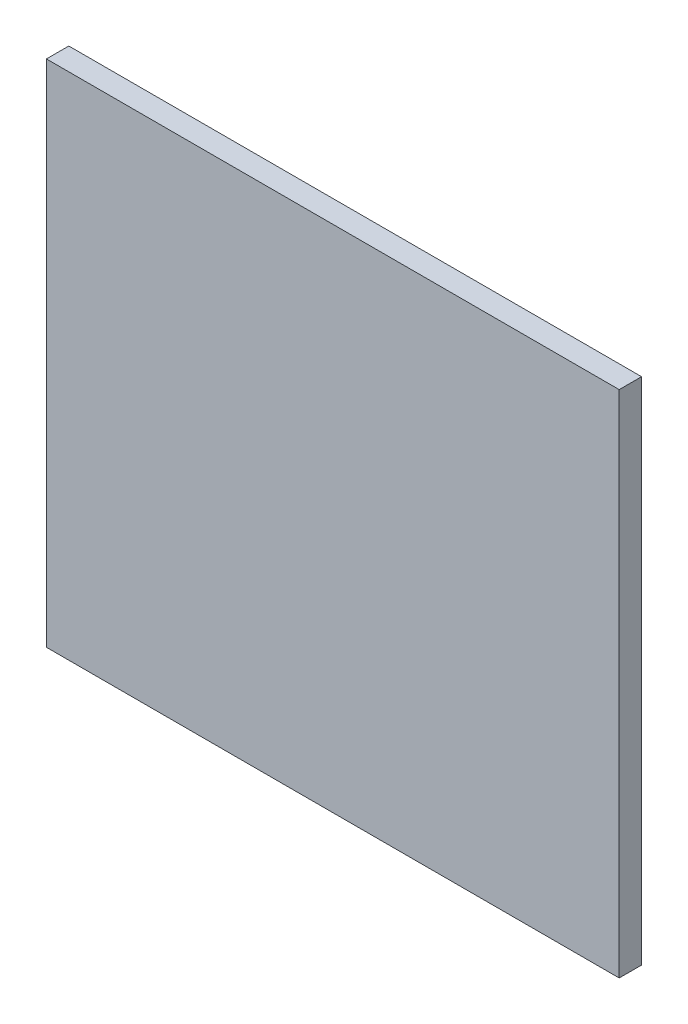
ISO-10303-21;
HEADER;
FILE_DESCRIPTION(('STEP AP214'),'2;1');
FILE_NAME('part.step','',(''),(''),'','','');
FILE_SCHEMA(('AUTOMOTIVE_DESIGN { 1 0 10303 214 1 1 1 1 }'));
ENDSEC;
DATA;
#1=APPLICATION_CONTEXT('core data for automotive mechanical design processes');
#2=APPLICATION_PROTOCOL_DEFINITION('international standard','automotive_design',2000,#1);
#3=PRODUCT_CONTEXT('',#1,'mechanical');
#4=PRODUCT('Part','Part','',(#3));
#5=PRODUCT_RELATED_PRODUCT_CATEGORY('part','',(#4));
#6=PRODUCT_DEFINITION_FORMATION('','',#4);
#7=PRODUCT_DEFINITION_CONTEXT('part definition',#1,'design');
#8=PRODUCT_DEFINITION('design','',#6,#7);
#9=PRODUCT_DEFINITION_SHAPE('','',#8);
#10=(LENGTH_UNIT() NAMED_UNIT(*) SI_UNIT(.MILLI.,.METRE.));
#11=(NAMED_UNIT(*) PLANE_ANGLE_UNIT() SI_UNIT($,.RADIAN.));
#12=(NAMED_UNIT(*) SI_UNIT($,.STERADIAN.) SOLID_ANGLE_UNIT());
#13=UNCERTAINTY_MEASURE_WITH_UNIT(LENGTH_MEASURE(1.E-05),#10,'distance_accuracy_value','');
#14=(GEOMETRIC_REPRESENTATION_CONTEXT(3) GLOBAL_UNCERTAINTY_ASSIGNED_CONTEXT((#13)) GLOBAL_UNIT_ASSIGNED_CONTEXT((#10,
#11,#12)) REPRESENTATION_CONTEXT('',''));
#15=CARTESIAN_POINT('',(0.,0.,0.));
#16=DIRECTION('',(0.,0.,1.));
#17=DIRECTION('',(1.,0.,0.));
#18=AXIS2_PLACEMENT_3D('',#15,#16,#17);
#19=CARTESIAN_POINT('',(91.50000122,25.5000006,-1.606522083282));
#20=DIRECTION('',(0.,8.74227765734797E-08,-0.999999999999996));
#21=DIRECTION('',(0.,0.999999999999996,8.74227765734797E-08));
#22=AXIS2_PLACEMENT_3D('',#19,#20,#21);
#23=PLANE('',#22);
#24=DIRECTION('',(-4.371138800918E-08,-0.999999999999999,0.));
#25=VECTOR('',#24,1.);
#26=CARTESIAN_POINT('',(88.940001059251,21.822500711901,-1.606522282388));
#27=LINE('',#26,#25);
#28=CARTESIAN_POINT('',(88.940001120447,23.2225006603219,-1.60652228238784));
#29=VERTEX_POINT('',#28);
#30=CARTESIAN_POINT('',(88.9400012199998,27.777500711901,-1.60652198372956));
#31=VERTEX_POINT('',#30);
#32=EDGE_CURVE('E61',#29,#31,#27,.F.);
#33=ORIENTED_EDGE('',*,*,#32,.F.);
#34=DIRECTION('',(0.999999999999999,-4.37113880091796E-08,0.));
#35=VECTOR('',#34,1.);
#36=CARTESIAN_POINT('',(94.060001120447,23.222500488099,-1.606522282388));
#37=LINE('',#36,#35);
#38=CARTESIAN_POINT('',(94.0600012200002,23.222500488099,-1.60652218283494));
#39=VERTEX_POINT('',#38);
#40=EDGE_CURVE('E56',#39,#29,#37,.F.);
#41=ORIENTED_EDGE('',*,*,#40,.F.);
#42=DIRECTION('',(4.371138800918E-08,0.999999999999999,0.));
#43=VECTOR('',#42,1.);
#44=CARTESIAN_POINT('',(94.060001380749,29.177500488099,-1.606521884177));
#45=LINE('',#44,#43);
#46=CARTESIAN_POINT('',(94.060001319553,27.7775006043709,-1.60652188417681));
#47=VERTEX_POINT('',#46);
#48=EDGE_CURVE('E20',#47,#39,#45,.F.);
#49=ORIENTED_EDGE('',*,*,#48,.F.);
#50=DIRECTION('',(0.999999999999999,-4.37113880091796E-08,0.));
#51=VECTOR('',#50,1.);
#52=CARTESIAN_POINT('',(88.940001319553,27.777500711901,-1.606521884177));
#53=LINE('',#52,#51);
#54=EDGE_CURVE('E79',#31,#47,#53,.T.);
#55=ORIENTED_EDGE('',*,*,#54,.F.);
#56=EDGE_LOOP('',(#33,#41,#49,#55));
#57=FACE_BOUND('',#56,.T.);
#58=ADVANCED_FACE('F17',(#57),#23,.F.);
#59=CARTESIAN_POINT('',(94.060001380749,29.177500488099,-1.606521761785));
#60=DIRECTION('',(0.999999999999999,-4.371138800918E-08,0.));
#61=DIRECTION('',(4.371138800918E-08,0.999999999999999,0.));
#62=AXIS2_PLACEMENT_3D('',#59,#60,#61);
#63=PLANE('',#62);
#64=DIRECTION('',(0.,8.74227765734797E-08,-0.999999999999996));
#65=VECTOR('',#64,1.);
#66=CARTESIAN_POINT('',(94.060001120447,23.222500488099,-1.606522282388));
#67=LINE('',#66,#65);
#68=CARTESIAN_POINT('',(94.0600011702238,23.2225004968411,-1.80652228238785));
#69=VERTEX_POINT('',#68);
#70=EDGE_CURVE('E63',#69,#39,#67,.F.);
#71=ORIENTED_EDGE('',*,*,#70,.F.);
#72=DIRECTION('',(0.,0.999999999999996,8.74227765734797E-08));
#73=VECTOR('',#72,1.);
#74=CARTESIAN_POINT('',(94.060001319553,25.500000617485,-1.806522083282));
#75=LINE('',#74,#73);
#76=CARTESIAN_POINT('',(94.060001319553,27.7775005615338,-1.8065220832824));
#77=VERTEX_POINT('',#76);
#78=EDGE_CURVE('E83',#77,#69,#75,.F.);
#79=ORIENTED_EDGE('',*,*,#78,.F.);
#80=DIRECTION('',(0.,-8.74227765734797E-08,0.999999999999996));
#81=VECTOR('',#80,1.);
#82=CARTESIAN_POINT('',(94.060001319553,27.7775004880987,-1.60652188417702));
#83=LINE('',#82,#81);
#84=EDGE_CURVE('E68',#47,#77,#83,.F.);
#85=ORIENTED_EDGE('',*,*,#84,.F.);
#86=ORIENTED_EDGE('',*,*,#48,.T.);
#87=EDGE_LOOP('',(#71,#79,#85,#86));
#88=FACE_BOUND('',#87,.T.);
#89=ADVANCED_FACE('F65',(#88),#63,.T.);
#90=CARTESIAN_POINT('',(94.060001120447,23.222500488099,-1.606522282388));
#91=DIRECTION('',(-4.37113880091798E-08,-0.999999999999995,-8.74227765734796E-08));
#92=DIRECTION('',(0.,8.74227765734797E-08,-0.999999999999996));
#93=AXIS2_PLACEMENT_3D('',#90,#91,#92);
#94=PLANE('',#93);
#95=DIRECTION('',(1.,0.,0.));
#96=VECTOR('',#95,1.);
#97=CARTESIAN_POINT('',(91.50000122,23.222500505583,-1.80652228238738));
#98=LINE('',#97,#96);
#99=CARTESIAN_POINT('',(88.940001120447,23.2225006734352,-1.8065221828351));
#100=VERTEX_POINT('',#99);
#101=EDGE_CURVE('E72',#69,#100,#98,.F.);
#102=ORIENTED_EDGE('',*,*,#101,.F.);
#103=ORIENTED_EDGE('',*,*,#70,.T.);
#104=ORIENTED_EDGE('',*,*,#40,.T.);
#105=DIRECTION('',(0.,0.,1.));
#106=VECTOR('',#105,1.);
#107=CARTESIAN_POINT('',(88.940001120447,23.222500729386,-1.60652240478));
#108=LINE('',#107,#106);
#109=EDGE_CURVE('E74',#100,#29,#108,.T.);
#110=ORIENTED_EDGE('',*,*,#109,.F.);
#111=EDGE_LOOP('',(#102,#103,#104,#110));
#112=FACE_BOUND('',#111,.T.);
#113=ADVANCED_FACE('F70',(#112),#94,.T.);
#114=CARTESIAN_POINT('',(88.940001059251,21.822500711901,-1.60652240478));
#115=DIRECTION('',(-0.999999999999999,4.371138800918E-08,0.));
#116=DIRECTION('',(-4.371138800918E-08,-0.999999999999999,0.));
#117=AXIS2_PLACEMENT_3D('',#114,#115,#116);
#118=PLANE('',#117);
#119=ORIENTED_EDGE('',*,*,#109,.T.);
#120=ORIENTED_EDGE('',*,*,#32,.T.);
#121=DIRECTION('',(0.,-8.74227765734797E-08,0.999999999999996));
#122=VECTOR('',#121,1.);
#123=CARTESIAN_POINT('',(88.940001319553,27.777500711901,-1.606521884177));
#124=LINE('',#123,#122);
#125=CARTESIAN_POINT('',(88.9400012697762,27.7775007206434,-1.8065218841769));
#126=VERTEX_POINT('',#125);
#127=EDGE_CURVE('E35',#126,#31,#124,.T.);
#128=ORIENTED_EDGE('',*,*,#127,.F.);
#129=DIRECTION('',(0.,0.999999999999996,8.74227765734797E-08));
#130=VECTOR('',#129,1.);
#131=CARTESIAN_POINT('',(88.940001120447,25.500000617485,-1.806522083282));
#132=LINE('',#131,#130);
#133=EDGE_CURVE('E26',#100,#126,#132,.T.);
#134=ORIENTED_EDGE('',*,*,#133,.F.);
#135=EDGE_LOOP('',(#119,#120,#128,#134));
#136=FACE_BOUND('',#135,.T.);
#137=ADVANCED_FACE('F89',(#136),#118,.T.);
#138=CARTESIAN_POINT('',(88.940001319553,27.777500711901,-1.606521884177));
#139=DIRECTION('',(4.37113880091798E-08,0.999999999999995,8.74227765734796E-08));
#140=DIRECTION('',(0.,-8.74227765734797E-08,0.999999999999996));
#141=AXIS2_PLACEMENT_3D('',#138,#139,#140);
#142=PLANE('',#141);
#143=DIRECTION('',(1.,0.,0.));
#144=VECTOR('',#143,1.);
#145=CARTESIAN_POINT('',(91.50000122,27.777500729386,-1.80652188417662));
#146=LINE('',#145,#144);
#147=EDGE_CURVE('E11',#126,#77,#146,.T.);
#148=ORIENTED_EDGE('',*,*,#147,.F.);
#149=ORIENTED_EDGE('',*,*,#127,.T.);
#150=ORIENTED_EDGE('',*,*,#54,.T.);
#151=ORIENTED_EDGE('',*,*,#84,.T.);
#152=EDGE_LOOP('',(#148,#149,#150,#151));
#153=FACE_BOUND('',#152,.T.);
#154=ADVANCED_FACE('F91',(#153),#142,.T.);
#155=CARTESIAN_POINT('',(91.50000122,25.500000617485,-1.806522083282));
#156=DIRECTION('',(0.,8.74227765734797E-08,-0.999999999999996));
#157=DIRECTION('',(0.,0.999999999999996,8.74227765734797E-08));
#158=AXIS2_PLACEMENT_3D('',#155,#156,#157);
#159=PLANE('',#158);
#160=ORIENTED_EDGE('',*,*,#133,.T.);
#161=ORIENTED_EDGE('',*,*,#147,.T.);
#162=ORIENTED_EDGE('',*,*,#78,.T.);
#163=ORIENTED_EDGE('',*,*,#101,.T.);
#164=EDGE_LOOP('',(#160,#161,#162,#163));
#165=FACE_BOUND('',#164,.T.);
#166=ADVANCED_FACE('F88',(#165),#159,.T.);
#167=CLOSED_SHELL('',(#58,#89,#113,#137,#154,#166));
#168=MANIFOLD_SOLID_BREP('B1',#167);
#169=ADVANCED_BREP_SHAPE_REPRESENTATION('',(#18,#168),#14);
#170=SHAPE_DEFINITION_REPRESENTATION(#9,#169);
ENDSEC;
END-ISO-10303-21;
